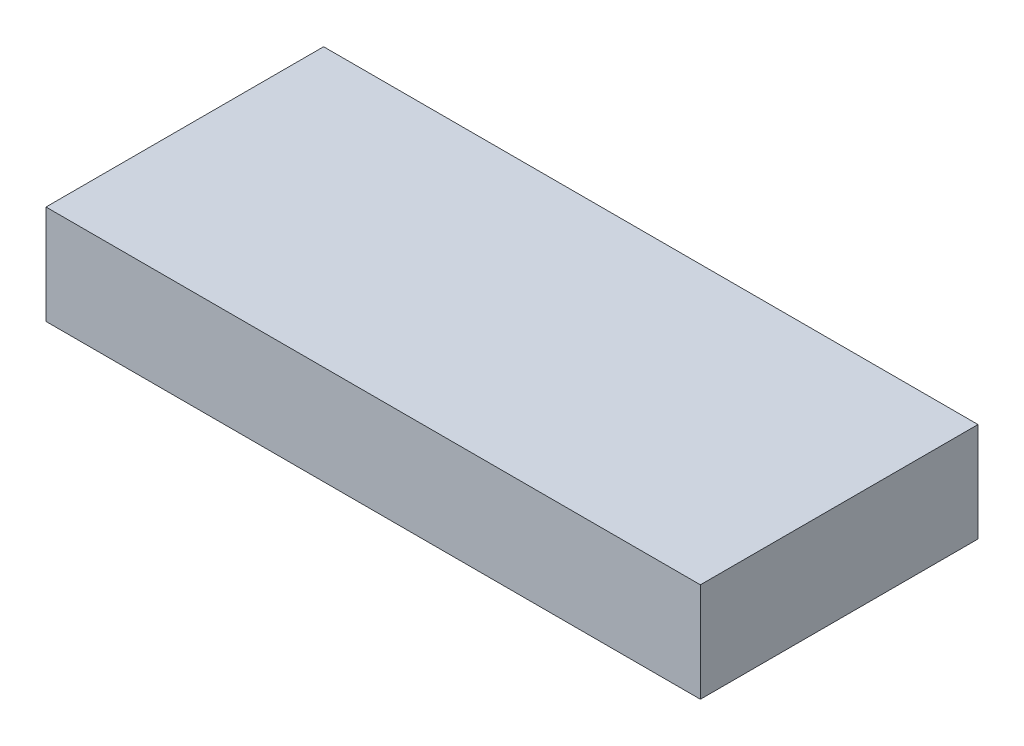
ISO-10303-21;
HEADER;
FILE_DESCRIPTION(('STEP AP214'),'2;1');
FILE_NAME('part.step','',(''),(''),'','','');
FILE_SCHEMA(('AUTOMOTIVE_DESIGN { 1 0 10303 214 1 1 1 1 }'));
ENDSEC;
DATA;
#1=APPLICATION_CONTEXT('core data for automotive mechanical design processes');
#2=APPLICATION_PROTOCOL_DEFINITION('international standard','automotive_design',2000,#1);
#3=PRODUCT_CONTEXT('',#1,'mechanical');
#4=PRODUCT('Part','Part','',(#3));
#5=PRODUCT_RELATED_PRODUCT_CATEGORY('part','',(#4));
#6=PRODUCT_DEFINITION_FORMATION('','',#4);
#7=PRODUCT_DEFINITION_CONTEXT('part definition',#1,'design');
#8=PRODUCT_DEFINITION('design','',#6,#7);
#9=PRODUCT_DEFINITION_SHAPE('','',#8);
#10=(LENGTH_UNIT() NAMED_UNIT(*) SI_UNIT(.MILLI.,.METRE.));
#11=(NAMED_UNIT(*) PLANE_ANGLE_UNIT() SI_UNIT($,.RADIAN.));
#12=(NAMED_UNIT(*) SI_UNIT($,.STERADIAN.) SOLID_ANGLE_UNIT());
#13=UNCERTAINTY_MEASURE_WITH_UNIT(LENGTH_MEASURE(1.E-05),#10,'distance_accuracy_value','');
#14=(GEOMETRIC_REPRESENTATION_CONTEXT(3) GLOBAL_UNCERTAINTY_ASSIGNED_CONTEXT((#13)) GLOBAL_UNIT_ASSIGNED_CONTEXT((#10,
#11,#12)) REPRESENTATION_CONTEXT('',''));
#15=CARTESIAN_POINT('',(0.,0.,0.));
#16=DIRECTION('',(0.,0.,1.));
#17=DIRECTION('',(1.,0.,0.));
#18=AXIS2_PLACEMENT_3D('',#15,#16,#17);
#19=CARTESIAN_POINT('',(0.,2.54,0.));
#20=DIRECTION('',(1.,0.,0.));
#21=DIRECTION('',(0.,0.,-1.));
#22=AXIS2_PLACEMENT_3D('',#19,#20,#21);
#23=PLANE('',#22);
#24=DIRECTION('',(0.,0.,1.));
#25=VECTOR('',#24,1.);
#26=CARTESIAN_POINT('',(0.,0.,0.));
#27=LINE('',#26,#25);
#28=CARTESIAN_POINT('',(0.,0.,-7.1882));
#29=VERTEX_POINT('',#28);
#30=CARTESIAN_POINT('',(0.,0.,0.));
#31=VERTEX_POINT('',#30);
#32=EDGE_CURVE('E131',#29,#31,#27,.T.);
#33=ORIENTED_EDGE('',*,*,#32,.T.);
#34=DIRECTION('',(0.,-1.,0.));
#35=VECTOR('',#34,1.);
#36=CARTESIAN_POINT('',(0.,2.54,0.));
#37=LINE('',#36,#35);
#38=CARTESIAN_POINT('',(0.,2.54,0.));
#39=VERTEX_POINT('',#38);
#40=EDGE_CURVE('E11',#39,#31,#37,.T.);
#41=ORIENTED_EDGE('',*,*,#40,.F.);
#42=DIRECTION('',(0.,0.,1.));
#43=VECTOR('',#42,1.);
#44=CARTESIAN_POINT('',(0.,2.54,0.));
#45=LINE('',#44,#43);
#46=CARTESIAN_POINT('',(0.,2.54,-7.1882));
#47=VERTEX_POINT('',#46);
#48=EDGE_CURVE('E140',#47,#39,#45,.T.);
#49=ORIENTED_EDGE('',*,*,#48,.F.);
#50=DIRECTION('',(0.,-1.,0.));
#51=VECTOR('',#50,1.);
#52=CARTESIAN_POINT('',(0.,2.54,-7.1882));
#53=LINE('',#52,#51);
#54=EDGE_CURVE('E149',#47,#29,#53,.T.);
#55=ORIENTED_EDGE('',*,*,#54,.T.);
#56=EDGE_LOOP('',(#33,#41,#49,#55));
#57=FACE_BOUND('',#56,.T.);
#58=ADVANCED_FACE('F33',(#57),#23,.F.);
#59=CARTESIAN_POINT('',(0.,2.54,0.));
#60=DIRECTION('',(0.,0.,-1.));
#61=DIRECTION('',(-1.,0.,0.));
#62=AXIS2_PLACEMENT_3D('',#59,#60,#61);
#63=PLANE('',#62);
#64=DIRECTION('',(1.,0.,0.));
#65=VECTOR('',#64,1.);
#66=CARTESIAN_POINT('',(0.,0.,0.));
#67=LINE('',#66,#65);
#68=CARTESIAN_POINT('',(28.448,0.,0.));
#69=VERTEX_POINT('',#68);
#70=EDGE_CURVE('E134',#31,#69,#67,.T.);
#71=ORIENTED_EDGE('',*,*,#70,.T.);
#72=DIRECTION('',(0.,-1.,0.));
#73=VECTOR('',#72,1.);
#74=CARTESIAN_POINT('',(28.448,2.54,0.));
#75=LINE('',#74,#73);
#76=CARTESIAN_POINT('',(28.448,2.54,0.));
#77=VERTEX_POINT('',#76);
#78=EDGE_CURVE('E41',#77,#69,#75,.T.);
#79=ORIENTED_EDGE('',*,*,#78,.F.);
#80=DIRECTION('',(1.,0.,0.));
#81=VECTOR('',#80,1.);
#82=CARTESIAN_POINT('',(0.,2.54,0.));
#83=LINE('',#82,#81);
#84=EDGE_CURVE('E75',#39,#77,#83,.T.);
#85=ORIENTED_EDGE('',*,*,#84,.F.);
#86=ORIENTED_EDGE('',*,*,#40,.T.);
#87=EDGE_LOOP('',(#71,#79,#85,#86));
#88=FACE_BOUND('',#87,.T.);
#89=ADVANCED_FACE('F175',(#88),#63,.F.);
#90=CARTESIAN_POINT('',(28.448,2.54,0.));
#91=DIRECTION('',(-1.,0.,0.));
#92=DIRECTION('',(0.,0.,1.));
#93=AXIS2_PLACEMENT_3D('',#90,#91,#92);
#94=PLANE('',#93);
#95=DIRECTION('',(0.,0.,-1.));
#96=VECTOR('',#95,1.);
#97=CARTESIAN_POINT('',(28.448,0.,0.));
#98=LINE('',#97,#96);
#99=CARTESIAN_POINT('',(28.448,0.,-7.1882));
#100=VERTEX_POINT('',#99);
#101=EDGE_CURVE('E65',#69,#100,#98,.T.);
#102=ORIENTED_EDGE('',*,*,#101,.T.);
#103=DIRECTION('',(0.,-1.,0.));
#104=VECTOR('',#103,1.);
#105=CARTESIAN_POINT('',(28.448,2.54,-7.1882));
#106=LINE('',#105,#104);
#107=CARTESIAN_POINT('',(28.448,2.54,-7.1882));
#108=VERTEX_POINT('',#107);
#109=EDGE_CURVE('E49',#108,#100,#106,.T.);
#110=ORIENTED_EDGE('',*,*,#109,.F.);
#111=DIRECTION('',(0.,0.,-1.));
#112=VECTOR('',#111,1.);
#113=CARTESIAN_POINT('',(28.448,2.54,0.));
#114=LINE('',#113,#112);
#115=EDGE_CURVE('E144',#77,#108,#114,.T.);
#116=ORIENTED_EDGE('',*,*,#115,.F.);
#117=ORIENTED_EDGE('',*,*,#78,.T.);
#118=EDGE_LOOP('',(#102,#110,#116,#117));
#119=FACE_BOUND('',#118,.T.);
#120=ADVANCED_FACE('F155',(#119),#94,.F.);
#121=CARTESIAN_POINT('',(0.,2.54,-7.1882));
#122=DIRECTION('',(0.,0.,1.));
#123=DIRECTION('',(1.,0.,0.));
#124=AXIS2_PLACEMENT_3D('',#121,#122,#123);
#125=PLANE('',#124);
#126=DIRECTION('',(-1.,0.,0.));
#127=VECTOR('',#126,1.);
#128=CARTESIAN_POINT('',(0.,0.,-7.1882));
#129=LINE('',#128,#127);
#130=EDGE_CURVE('E70',#100,#29,#129,.T.);
#131=ORIENTED_EDGE('',*,*,#130,.T.);
#132=ORIENTED_EDGE('',*,*,#54,.F.);
#133=DIRECTION('',(-1.,0.,0.));
#134=VECTOR('',#133,1.);
#135=CARTESIAN_POINT('',(0.,2.54,-7.1882));
#136=LINE('',#135,#134);
#137=EDGE_CURVE('E147',#108,#47,#136,.T.);
#138=ORIENTED_EDGE('',*,*,#137,.F.);
#139=ORIENTED_EDGE('',*,*,#109,.T.);
#140=EDGE_LOOP('',(#131,#132,#138,#139));
#141=FACE_BOUND('',#140,.T.);
#142=ADVANCED_FACE('F160',(#141),#125,.F.);
#143=CARTESIAN_POINT('',(0.,0.,0.));
#144=DIRECTION('',(0.,-1.,0.));
#145=DIRECTION('',(0.,0.,-1.));
#146=AXIS2_PLACEMENT_3D('',#143,#144,#145);
#147=PLANE('',#146);
#148=ORIENTED_EDGE('',*,*,#32,.F.);
#149=ORIENTED_EDGE('',*,*,#130,.F.);
#150=ORIENTED_EDGE('',*,*,#101,.F.);
#151=ORIENTED_EDGE('',*,*,#70,.F.);
#152=EDGE_LOOP('',(#148,#149,#150,#151));
#153=FACE_BOUND('',#152,.T.);
#154=ADVANCED_FACE('F158',(#153),#147,.T.);
#155=CARTESIAN_POINT('',(0.,2.54,0.));
#156=DIRECTION('',(0.,-1.,0.));
#157=DIRECTION('',(0.,0.,-1.));
#158=AXIS2_PLACEMENT_3D('',#155,#156,#157);
#159=PLANE('',#158);
#160=DIRECTION('',(0.,0.,-1.));
#161=VECTOR('',#160,1.);
#162=CARTESIAN_POINT('',(30.988,2.54,3.5179));
#163=LINE('',#162,#161);
#164=CARTESIAN_POINT('',(30.988,2.54,3.5179));
#165=VERTEX_POINT('',#164);
#166=CARTESIAN_POINT('',(30.988,2.54,-10.7061));
#167=VERTEX_POINT('',#166);
#168=EDGE_CURVE('E130',#165,#167,#163,.T.);
#169=ORIENTED_EDGE('',*,*,#168,.F.);
#170=DIRECTION('',(1.,0.,0.));
#171=VECTOR('',#170,1.);
#172=CARTESIAN_POINT('',(-2.54,2.54,3.5179));
#173=LINE('',#172,#171);
#174=CARTESIAN_POINT('',(-2.54,2.54,3.5179));
#175=VERTEX_POINT('',#174);
#176=EDGE_CURVE('E126',#175,#165,#173,.T.);
#177=ORIENTED_EDGE('',*,*,#176,.F.);
#178=DIRECTION('',(0.,0.,1.));
#179=VECTOR('',#178,1.);
#180=CARTESIAN_POINT('',(-2.54,2.54,3.5179));
#181=LINE('',#180,#179);
#182=CARTESIAN_POINT('',(-2.54,2.54,-10.7061));
#183=VERTEX_POINT('',#182);
#184=EDGE_CURVE('E202',#183,#175,#181,.T.);
#185=ORIENTED_EDGE('',*,*,#184,.F.);
#186=DIRECTION('',(-1.,0.,0.));
#187=VECTOR('',#186,1.);
#188=CARTESIAN_POINT('',(-2.54,2.54,-10.7061));
#189=LINE('',#188,#187);
#190=EDGE_CURVE('E205',#167,#183,#189,.T.);
#191=ORIENTED_EDGE('',*,*,#190,.F.);
#192=EDGE_LOOP('',(#169,#177,#185,#191));
#193=FACE_BOUND('',#192,.T.);
#194=ORIENTED_EDGE('',*,*,#48,.T.);
#195=ORIENTED_EDGE('',*,*,#84,.T.);
#196=ORIENTED_EDGE('',*,*,#115,.T.);
#197=ORIENTED_EDGE('',*,*,#137,.T.);
#198=EDGE_LOOP('',(#194,#195,#196,#197));
#199=FACE_BOUND('',#198,.T.);
#200=ADVANCED_FACE('F162',(#193,#199),#159,.T.);
#201=CARTESIAN_POINT('',(30.988,7.62,3.5179));
#202=DIRECTION('',(-1.,0.,0.));
#203=DIRECTION('',(0.,0.,1.));
#204=AXIS2_PLACEMENT_3D('',#201,#202,#203);
#205=PLANE('',#204);
#206=ORIENTED_EDGE('',*,*,#168,.T.);
#207=DIRECTION('',(0.,-1.,0.));
#208=VECTOR('',#207,1.);
#209=CARTESIAN_POINT('',(30.988,7.62,-10.7061));
#210=LINE('',#209,#208);
#211=CARTESIAN_POINT('',(30.988,7.62,-10.7061));
#212=VERTEX_POINT('',#211);
#213=EDGE_CURVE('E110',#212,#167,#210,.T.);
#214=ORIENTED_EDGE('',*,*,#213,.F.);
#215=DIRECTION('',(0.,0.,-1.));
#216=VECTOR('',#215,1.);
#217=CARTESIAN_POINT('',(30.988,7.62,3.5179));
#218=LINE('',#217,#216);
#219=CARTESIAN_POINT('',(30.988,7.62,3.5179));
#220=VERTEX_POINT('',#219);
#221=EDGE_CURVE('E117',#220,#212,#218,.T.);
#222=ORIENTED_EDGE('',*,*,#221,.F.);
#223=DIRECTION('',(0.,-1.,0.));
#224=VECTOR('',#223,1.);
#225=CARTESIAN_POINT('',(30.988,7.62,3.5179));
#226=LINE('',#225,#224);
#227=EDGE_CURVE('E199',#220,#165,#226,.T.);
#228=ORIENTED_EDGE('',*,*,#227,.T.);
#229=EDGE_LOOP('',(#206,#214,#222,#228));
#230=FACE_BOUND('',#229,.T.);
#231=ADVANCED_FACE('F128',(#230),#205,.F.);
#232=CARTESIAN_POINT('',(-2.54,7.62,-10.7061));
#233=DIRECTION('',(0.,0.,1.));
#234=DIRECTION('',(1.,0.,0.));
#235=AXIS2_PLACEMENT_3D('',#232,#233,#234);
#236=PLANE('',#235);
#237=ORIENTED_EDGE('',*,*,#190,.T.);
#238=DIRECTION('',(0.,-1.,0.));
#239=VECTOR('',#238,1.);
#240=CARTESIAN_POINT('',(-2.54,7.62,-10.7061));
#241=LINE('',#240,#239);
#242=CARTESIAN_POINT('',(-2.54,7.62,-10.7061));
#243=VERTEX_POINT('',#242);
#244=EDGE_CURVE('E113',#243,#183,#241,.T.);
#245=ORIENTED_EDGE('',*,*,#244,.F.);
#246=DIRECTION('',(-1.,0.,0.));
#247=VECTOR('',#246,1.);
#248=CARTESIAN_POINT('',(-2.54,7.62,-10.7061));
#249=LINE('',#248,#247);
#250=EDGE_CURVE('E106',#212,#243,#249,.T.);
#251=ORIENTED_EDGE('',*,*,#250,.F.);
#252=ORIENTED_EDGE('',*,*,#213,.T.);
#253=EDGE_LOOP('',(#237,#245,#251,#252));
#254=FACE_BOUND('',#253,.T.);
#255=ADVANCED_FACE('F108',(#254),#236,.F.);
#256=CARTESIAN_POINT('',(-2.54,7.62,3.5179));
#257=DIRECTION('',(1.,0.,0.));
#258=DIRECTION('',(0.,0.,-1.));
#259=AXIS2_PLACEMENT_3D('',#256,#257,#258);
#260=PLANE('',#259);
#261=ORIENTED_EDGE('',*,*,#184,.T.);
#262=DIRECTION('',(0.,-1.,0.));
#263=VECTOR('',#262,1.);
#264=CARTESIAN_POINT('',(-2.54,7.62,3.5179));
#265=LINE('',#264,#263);
#266=CARTESIAN_POINT('',(-2.54,7.62,3.5179));
#267=VERTEX_POINT('',#266);
#268=EDGE_CURVE('E136',#267,#175,#265,.T.);
#269=ORIENTED_EDGE('',*,*,#268,.F.);
#270=DIRECTION('',(0.,0.,1.));
#271=VECTOR('',#270,1.);
#272=CARTESIAN_POINT('',(-2.54,7.62,3.5179));
#273=LINE('',#272,#271);
#274=EDGE_CURVE('E116',#243,#267,#273,.T.);
#275=ORIENTED_EDGE('',*,*,#274,.F.);
#276=ORIENTED_EDGE('',*,*,#244,.T.);
#277=EDGE_LOOP('',(#261,#269,#275,#276));
#278=FACE_BOUND('',#277,.T.);
#279=ADVANCED_FACE('F188',(#278),#260,.F.);
#280=CARTESIAN_POINT('',(-2.54,7.62,3.5179));
#281=DIRECTION('',(0.,0.,-1.));
#282=DIRECTION('',(-1.,0.,0.));
#283=AXIS2_PLACEMENT_3D('',#280,#281,#282);
#284=PLANE('',#283);
#285=ORIENTED_EDGE('',*,*,#176,.T.);
#286=ORIENTED_EDGE('',*,*,#227,.F.);
#287=DIRECTION('',(1.,0.,0.));
#288=VECTOR('',#287,1.);
#289=CARTESIAN_POINT('',(-2.54,7.62,3.5179));
#290=LINE('',#289,#288);
#291=EDGE_CURVE('E122',#267,#220,#290,.T.);
#292=ORIENTED_EDGE('',*,*,#291,.F.);
#293=ORIENTED_EDGE('',*,*,#268,.T.);
#294=EDGE_LOOP('',(#285,#286,#292,#293));
#295=FACE_BOUND('',#294,.T.);
#296=ADVANCED_FACE('F190',(#295),#284,.F.);
#297=CARTESIAN_POINT('',(0.,7.62,0.));
#298=DIRECTION('',(0.,-1.,0.));
#299=DIRECTION('',(0.,0.,-1.));
#300=AXIS2_PLACEMENT_3D('',#297,#298,#299);
#301=PLANE('',#300);
#302=ORIENTED_EDGE('',*,*,#221,.T.);
#303=ORIENTED_EDGE('',*,*,#250,.T.);
#304=ORIENTED_EDGE('',*,*,#274,.T.);
#305=ORIENTED_EDGE('',*,*,#291,.T.);
#306=EDGE_LOOP('',(#302,#303,#304,#305));
#307=FACE_BOUND('',#306,.T.);
#308=ADVANCED_FACE('F120',(#307),#301,.F.);
#309=CLOSED_SHELL('',(#58,#89,#120,#142,#154,#200,#231,#255,#279,#296,#308));
#310=MANIFOLD_SOLID_BREP('B2',#309);
#311=ADVANCED_BREP_SHAPE_REPRESENTATION('',(#18,#310),#14);
#312=SHAPE_DEFINITION_REPRESENTATION(#9,#311);
ENDSEC;
END-ISO-10303-21;
